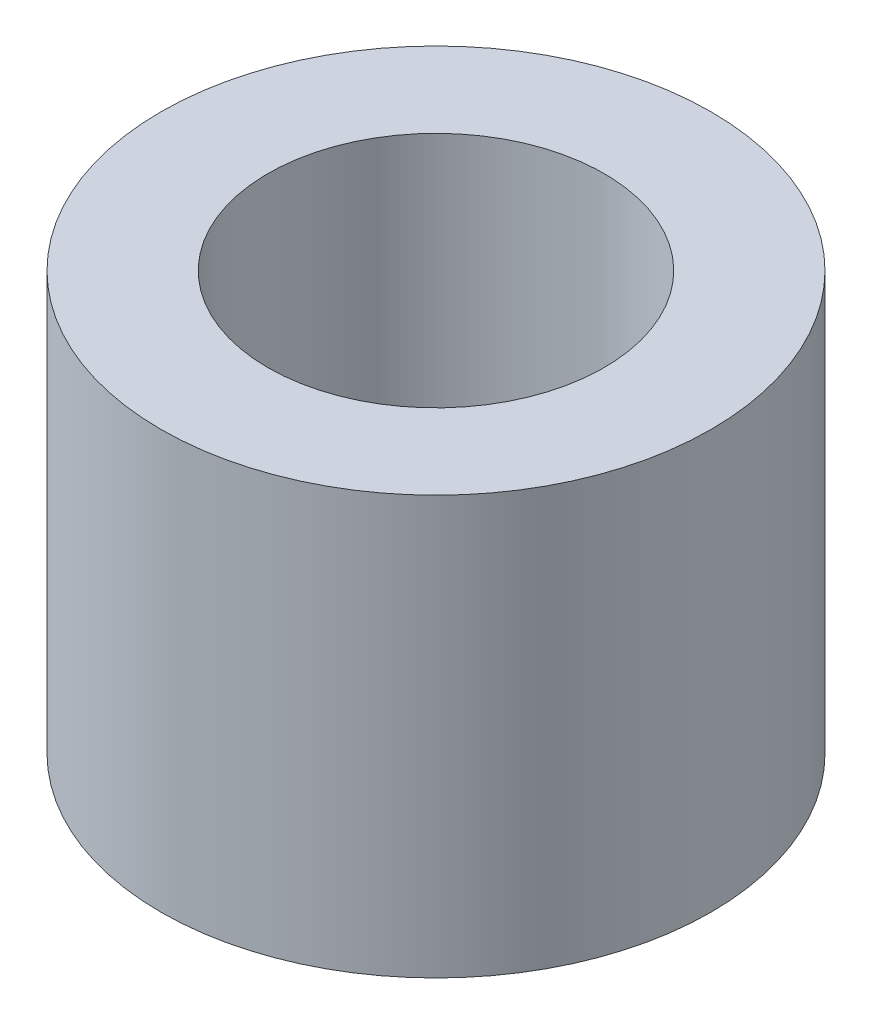
ISO-10303-21;
HEADER;
FILE_DESCRIPTION(('STEP AP214'),'2;1');
FILE_NAME('part.step','',(''),(''),'','','');
FILE_SCHEMA(('AUTOMOTIVE_DESIGN { 1 0 10303 214 1 1 1 1 }'));
ENDSEC;
DATA;
#1=APPLICATION_CONTEXT('core data for automotive mechanical design processes');
#2=APPLICATION_PROTOCOL_DEFINITION('international standard','automotive_design',2000,#1);
#3=PRODUCT_CONTEXT('',#1,'mechanical');
#4=PRODUCT('Part','Part','',(#3));
#5=PRODUCT_RELATED_PRODUCT_CATEGORY('part','',(#4));
#6=PRODUCT_DEFINITION_FORMATION('','',#4);
#7=PRODUCT_DEFINITION_CONTEXT('part definition',#1,'design');
#8=PRODUCT_DEFINITION('design','',#6,#7);
#9=PRODUCT_DEFINITION_SHAPE('','',#8);
#10=(LENGTH_UNIT() NAMED_UNIT(*) SI_UNIT(.MILLI.,.METRE.));
#11=(NAMED_UNIT(*) PLANE_ANGLE_UNIT() SI_UNIT($,.RADIAN.));
#12=(NAMED_UNIT(*) SI_UNIT($,.STERADIAN.) SOLID_ANGLE_UNIT());
#13=UNCERTAINTY_MEASURE_WITH_UNIT(LENGTH_MEASURE(1.E-05),#10,'distance_accuracy_value','');
#14=(GEOMETRIC_REPRESENTATION_CONTEXT(3) GLOBAL_UNCERTAINTY_ASSIGNED_CONTEXT((#13)) GLOBAL_UNIT_ASSIGNED_CONTEXT((#10,
#11,#12)) REPRESENTATION_CONTEXT('',''));
#15=CARTESIAN_POINT('',(0.,0.,0.));
#16=DIRECTION('',(0.,0.,1.));
#17=DIRECTION('',(1.,0.,0.));
#18=AXIS2_PLACEMENT_3D('',#15,#16,#17);
#19=CARTESIAN_POINT('',(0.,-9.525,0.));
#20=DIRECTION('',(0.,1.,0.));
#21=DIRECTION('',(0.,0.,1.));
#22=AXIS2_PLACEMENT_3D('',#19,#20,#21);
#23=CYLINDRICAL_SURFACE('',#22,7.9375);
#24=CARTESIAN_POINT('',(0.,-9.525,0.));
#25=DIRECTION('',(0.,1.,0.));
#26=DIRECTION('',(0.,0.,1.));
#27=AXIS2_PLACEMENT_3D('',#24,#25,#26);
#28=CIRCLE('',#27,7.9375);
#29=CARTESIAN_POINT('',(0.,-9.525,7.9375));
#30=VERTEX_POINT('',#29);
#31=EDGE_CURVE('E10',#30,#30,#28,.T.);
#32=CARTESIAN_POINT('',(0.,2.54,0.));
#33=DIRECTION('',(0.,1.,0.));
#34=DIRECTION('',(0.,0.,1.));
#35=AXIS2_PLACEMENT_3D('',#32,#33,#34);
#36=CIRCLE('',#35,7.9375);
#37=CARTESIAN_POINT('',(0.,2.54,7.9375));
#38=VERTEX_POINT('',#37);
#39=EDGE_CURVE('E40',#38,#38,#36,.T.);
#40=CARTESIAN_POINT('',(0.,-9.525,7.9375));
#41=CARTESIAN_POINT('',(0.,-9.39932291666667,7.9375));
#42=CARTESIAN_POINT('',(0.,-9.27364583333333,7.9375));
#43=CARTESIAN_POINT('',(0.,-9.02229166666667,7.9375));
#44=CARTESIAN_POINT('',(0.,-8.89661458333333,7.9375));
#45=CARTESIAN_POINT('',(0.,-8.64526041666667,7.9375));
#46=CARTESIAN_POINT('',(0.,-8.51958333333333,7.9375));
#47=CARTESIAN_POINT('',(0.,-8.26822916666667,7.9375));
#48=CARTESIAN_POINT('',(0.,-8.14255208333333,7.9375));
#49=CARTESIAN_POINT('',(0.,-7.89119791666667,7.9375));
#50=CARTESIAN_POINT('',(0.,-7.76552083333333,7.9375));
#51=CARTESIAN_POINT('',(0.,-7.51416666666667,7.9375));
#52=CARTESIAN_POINT('',(0.,-7.38848958333333,7.9375));
#53=CARTESIAN_POINT('',(0.,-7.13713541666667,7.9375));
#54=CARTESIAN_POINT('',(0.,-7.01145833333333,7.9375));
#55=CARTESIAN_POINT('',(0.,-6.76010416666667,7.9375));
#56=CARTESIAN_POINT('',(0.,-6.63442708333333,7.9375));
#57=CARTESIAN_POINT('',(0.,-6.38307291666667,7.9375));
#58=CARTESIAN_POINT('',(0.,-6.25739583333333,7.9375));
#59=CARTESIAN_POINT('',(0.,-6.00604166666667,7.9375));
#60=CARTESIAN_POINT('',(0.,-5.88036458333333,7.9375));
#61=CARTESIAN_POINT('',(0.,-5.62901041666667,7.9375));
#62=CARTESIAN_POINT('',(0.,-5.50333333333333,7.9375));
#63=CARTESIAN_POINT('',(0.,-5.25197916666667,7.9375));
#64=CARTESIAN_POINT('',(0.,-5.12630208333333,7.9375));
#65=CARTESIAN_POINT('',(0.,-4.87494791666667,7.9375));
#66=CARTESIAN_POINT('',(0.,-4.74927083333333,7.9375));
#67=CARTESIAN_POINT('',(0.,-4.49791666666667,7.9375));
#68=CARTESIAN_POINT('',(0.,-4.37223958333333,7.9375));
#69=CARTESIAN_POINT('',(0.,-4.12088541666667,7.9375));
#70=CARTESIAN_POINT('',(0.,-3.99520833333333,7.9375));
#71=CARTESIAN_POINT('',(0.,-3.74385416666667,7.9375));
#72=CARTESIAN_POINT('',(0.,-3.61817708333333,7.9375));
#73=CARTESIAN_POINT('',(0.,-3.36682291666667,7.9375));
#74=CARTESIAN_POINT('',(0.,-3.24114583333333,7.9375));
#75=CARTESIAN_POINT('',(0.,-2.98979166666667,7.9375));
#76=CARTESIAN_POINT('',(0.,-2.86411458333333,7.9375));
#77=CARTESIAN_POINT('',(0.,-2.61276041666667,7.9375));
#78=CARTESIAN_POINT('',(0.,-2.48708333333333,7.9375));
#79=CARTESIAN_POINT('',(0.,-2.23572916666667,7.9375));
#80=CARTESIAN_POINT('',(0.,-2.11005208333333,7.9375));
#81=CARTESIAN_POINT('',(0.,-1.85869791666667,7.9375));
#82=CARTESIAN_POINT('',(0.,-1.73302083333333,7.9375));
#83=CARTESIAN_POINT('',(0.,-1.48166666666667,7.9375));
#84=CARTESIAN_POINT('',(0.,-1.35598958333333,7.9375));
#85=CARTESIAN_POINT('',(0.,-1.10463541666667,7.9375));
#86=CARTESIAN_POINT('',(0.,-0.978958333333334,7.9375));
#87=CARTESIAN_POINT('',(0.,-0.727604166666667,7.9375));
#88=CARTESIAN_POINT('',(0.,-0.601927083333334,7.9375));
#89=CARTESIAN_POINT('',(0.,-0.350572916666668,7.9375));
#90=CARTESIAN_POINT('',(0.,-0.224895833333334,7.9375));
#91=CARTESIAN_POINT('',(0.,0.0264583333333326,7.9375));
#92=CARTESIAN_POINT('',(0.,0.152135416666666,7.9375));
#93=CARTESIAN_POINT('',(0.,0.403489583333334,7.9375));
#94=CARTESIAN_POINT('',(0.,0.529166666666667,7.9375));
#95=CARTESIAN_POINT('',(0.,0.780520833333333,7.9375));
#96=CARTESIAN_POINT('',(0.,0.906197916666667,7.9375));
#97=CARTESIAN_POINT('',(0.,1.15755208333333,7.9375));
#98=CARTESIAN_POINT('',(0.,1.28322916666667,7.9375));
#99=CARTESIAN_POINT('',(0.,1.53458333333333,7.9375));
#100=CARTESIAN_POINT('',(0.,1.66026041666667,7.9375));
#101=CARTESIAN_POINT('',(0.,1.91161458333333,7.9375));
#102=CARTESIAN_POINT('',(0.,2.03729166666667,7.9375));
#103=CARTESIAN_POINT('',(0.,2.28864583333333,7.9375));
#104=CARTESIAN_POINT('',(0.,2.41432291666667,7.9375));
#105=CARTESIAN_POINT('',(0.,2.54,7.9375));
#106=B_SPLINE_CURVE_WITH_KNOTS('',3,(#40,#41,#42,#43,#44,#45,#46,#47,#48,#49,#50,#51,#52,#53,
#54,#55,#56,#57,#58,#59,#60,#61,#62,#63,#64,#65,#66,#67,#68,#69,#70,#71,#72,#73,#74,#75,#76,#77,
#78,#79,#80,#81,#82,#83,#84,#85,#86,#87,#88,#89,#90,#91,#92,#93,#94,#95,#96,#97,#98,#99,#100,
#101,#102,#103,#104,#105),.UNSPECIFIED.,.F.,.F.,(4,2,2,2,2,2,2,2,2,2,2,2,2,2,2,2,2,2,2,2,2,2,2,
2,2,2,2,2,2,2,2,2,4),(0.,0.377031250000001,0.754062500000001,1.13109375,1.508125,1.88515625,
2.2621875,2.63921875,3.01625,3.39328125,3.7703125,4.14734375,4.524375,4.90140625,5.2784375,
5.65546875,6.0325,6.40953125,6.7865625,7.16359375,7.540625,7.91765625,8.2946875,8.67171875,
9.04875,9.42578125,9.8028125,10.17984375,10.556875,10.93390625,11.3109375,11.68796875,12.065),.UNSPECIFIED.);
#107=EDGE_CURVE('BSEAM30',#30,#38,#106,.T.);
#108=ORIENTED_EDGE('',*,*,#31,.T.);
#109=ORIENTED_EDGE('',*,*,#39,.F.);
#110=ORIENTED_EDGE('',*,*,#107,.T.);
#111=ORIENTED_EDGE('',*,*,#107,.F.);
#112=EDGE_LOOP('',(#108,#110,#109,#111));
#113=FACE_BOUND('',#112,.T.);
#114=ADVANCED_FACE('F30',(#113),#23,.T.);
#115=CARTESIAN_POINT('',(0.,-9.525,0.));
#116=DIRECTION('',(0.,1.,0.));
#117=DIRECTION('',(0.,0.,1.));
#118=AXIS2_PLACEMENT_3D('',#115,#116,#117);
#119=PLANE('',#118);
#120=CARTESIAN_POINT('',(0.,-9.525,0.));
#121=DIRECTION('',(0.,1.,0.));
#122=DIRECTION('',(0.,0.,1.));
#123=AXIS2_PLACEMENT_3D('',#120,#121,#122);
#124=CIRCLE('',#123,4.8514);
#125=CARTESIAN_POINT('',(0.,-9.525,4.8514));
#126=VERTEX_POINT('',#125);
#127=EDGE_CURVE('E36',#126,#126,#124,.T.);
#128=ORIENTED_EDGE('',*,*,#127,.T.);
#129=EDGE_LOOP('',(#128));
#130=FACE_BOUND('',#129,.T.);
#131=ORIENTED_EDGE('',*,*,#31,.F.);
#132=EDGE_LOOP('',(#131));
#133=FACE_BOUND('',#132,.T.);
#134=ADVANCED_FACE('F59',(#130,#133),#119,.F.);
#135=CARTESIAN_POINT('',(0.,-9.525,0.));
#136=DIRECTION('',(0.,1.,0.));
#137=DIRECTION('',(0.,0.,1.));
#138=AXIS2_PLACEMENT_3D('',#135,#136,#137);
#139=CYLINDRICAL_SURFACE('',#138,4.8514);
#140=CARTESIAN_POINT('',(0.,2.54,0.));
#141=DIRECTION('',(0.,1.,0.));
#142=DIRECTION('',(0.,0.,1.));
#143=AXIS2_PLACEMENT_3D('',#140,#141,#142);
#144=CIRCLE('',#143,4.8514);
#145=CARTESIAN_POINT('',(0.,2.54,4.8514));
#146=VERTEX_POINT('',#145);
#147=EDGE_CURVE('E44',#146,#146,#144,.T.);
#148=CARTESIAN_POINT('',(0.,-9.525,4.8514));
#149=CARTESIAN_POINT('',(0.,-9.39932291666667,4.8514));
#150=CARTESIAN_POINT('',(0.,-9.27364583333333,4.8514));
#151=CARTESIAN_POINT('',(0.,-9.02229166666667,4.8514));
#152=CARTESIAN_POINT('',(0.,-8.89661458333333,4.8514));
#153=CARTESIAN_POINT('',(0.,-8.64526041666667,4.8514));
#154=CARTESIAN_POINT('',(0.,-8.51958333333333,4.8514));
#155=CARTESIAN_POINT('',(0.,-8.26822916666667,4.8514));
#156=CARTESIAN_POINT('',(0.,-8.14255208333333,4.8514));
#157=CARTESIAN_POINT('',(0.,-7.89119791666667,4.8514));
#158=CARTESIAN_POINT('',(0.,-7.76552083333333,4.8514));
#159=CARTESIAN_POINT('',(0.,-7.51416666666667,4.8514));
#160=CARTESIAN_POINT('',(0.,-7.38848958333333,4.8514));
#161=CARTESIAN_POINT('',(0.,-7.13713541666667,4.8514));
#162=CARTESIAN_POINT('',(0.,-7.01145833333333,4.8514));
#163=CARTESIAN_POINT('',(0.,-6.76010416666667,4.8514));
#164=CARTESIAN_POINT('',(0.,-6.63442708333333,4.8514));
#165=CARTESIAN_POINT('',(0.,-6.38307291666667,4.8514));
#166=CARTESIAN_POINT('',(0.,-6.25739583333333,4.8514));
#167=CARTESIAN_POINT('',(0.,-6.00604166666667,4.8514));
#168=CARTESIAN_POINT('',(0.,-5.88036458333333,4.8514));
#169=CARTESIAN_POINT('',(0.,-5.62901041666667,4.8514));
#170=CARTESIAN_POINT('',(0.,-5.50333333333333,4.8514));
#171=CARTESIAN_POINT('',(0.,-5.25197916666667,4.8514));
#172=CARTESIAN_POINT('',(0.,-5.12630208333333,4.8514));
#173=CARTESIAN_POINT('',(0.,-4.87494791666667,4.8514));
#174=CARTESIAN_POINT('',(0.,-4.74927083333333,4.8514));
#175=CARTESIAN_POINT('',(0.,-4.49791666666667,4.8514));
#176=CARTESIAN_POINT('',(0.,-4.37223958333333,4.8514));
#177=CARTESIAN_POINT('',(0.,-4.12088541666667,4.8514));
#178=CARTESIAN_POINT('',(0.,-3.99520833333333,4.8514));
#179=CARTESIAN_POINT('',(0.,-3.74385416666667,4.8514));
#180=CARTESIAN_POINT('',(0.,-3.61817708333333,4.8514));
#181=CARTESIAN_POINT('',(0.,-3.36682291666667,4.8514));
#182=CARTESIAN_POINT('',(0.,-3.24114583333333,4.8514));
#183=CARTESIAN_POINT('',(0.,-2.98979166666667,4.8514));
#184=CARTESIAN_POINT('',(0.,-2.86411458333333,4.8514));
#185=CARTESIAN_POINT('',(0.,-2.61276041666667,4.8514));
#186=CARTESIAN_POINT('',(0.,-2.48708333333333,4.8514));
#187=CARTESIAN_POINT('',(0.,-2.23572916666667,4.8514));
#188=CARTESIAN_POINT('',(0.,-2.11005208333333,4.8514));
#189=CARTESIAN_POINT('',(0.,-1.85869791666667,4.8514));
#190=CARTESIAN_POINT('',(0.,-1.73302083333333,4.8514));
#191=CARTESIAN_POINT('',(0.,-1.48166666666667,4.8514));
#192=CARTESIAN_POINT('',(0.,-1.35598958333333,4.8514));
#193=CARTESIAN_POINT('',(0.,-1.10463541666667,4.8514));
#194=CARTESIAN_POINT('',(0.,-0.978958333333334,4.8514));
#195=CARTESIAN_POINT('',(0.,-0.727604166666667,4.8514));
#196=CARTESIAN_POINT('',(0.,-0.601927083333334,4.8514));
#197=CARTESIAN_POINT('',(0.,-0.350572916666668,4.8514));
#198=CARTESIAN_POINT('',(0.,-0.224895833333334,4.8514));
#199=CARTESIAN_POINT('',(0.,0.0264583333333326,4.8514));
#200=CARTESIAN_POINT('',(0.,0.152135416666666,4.8514));
#201=CARTESIAN_POINT('',(0.,0.403489583333334,4.8514));
#202=CARTESIAN_POINT('',(0.,0.529166666666667,4.8514));
#203=CARTESIAN_POINT('',(0.,0.780520833333333,4.8514));
#204=CARTESIAN_POINT('',(0.,0.906197916666667,4.8514));
#205=CARTESIAN_POINT('',(0.,1.15755208333333,4.8514));
#206=CARTESIAN_POINT('',(0.,1.28322916666667,4.8514));
#207=CARTESIAN_POINT('',(0.,1.53458333333333,4.8514));
#208=CARTESIAN_POINT('',(0.,1.66026041666667,4.8514));
#209=CARTESIAN_POINT('',(0.,1.91161458333333,4.8514));
#210=CARTESIAN_POINT('',(0.,2.03729166666667,4.8514));
#211=CARTESIAN_POINT('',(0.,2.28864583333333,4.8514));
#212=CARTESIAN_POINT('',(0.,2.41432291666667,4.8514));
#213=CARTESIAN_POINT('',(0.,2.54,4.8514));
#214=B_SPLINE_CURVE_WITH_KNOTS('',3,(#148,#149,#150,#151,#152,#153,#154,#155,#156,#157,#158,
#159,#160,#161,#162,#163,#164,#165,#166,#167,#168,#169,#170,#171,#172,#173,#174,#175,#176,#177,
#178,#179,#180,#181,#182,#183,#184,#185,#186,#187,#188,#189,#190,#191,#192,#193,#194,#195,#196,
#197,#198,#199,#200,#201,#202,#203,#204,#205,#206,#207,#208,#209,#210,#211,#212,#213),
.UNSPECIFIED.,.F.,.F.,(4,2,2,2,2,2,2,2,2,2,2,2,2,2,2,2,2,2,2,2,2,2,2,2,2,2,2,2,2,2,2,2,4),(0.,
0.377031250000001,0.754062500000001,1.13109375,1.508125,1.88515625,2.2621875,2.63921875,3.01625,
3.39328125,3.7703125,4.14734375,4.524375,4.90140625,5.2784375,5.65546875,6.0325,6.40953125,
6.7865625,7.16359375,7.540625,7.91765625,8.2946875,8.67171875,9.04875,9.42578125,9.8028125,
10.17984375,10.556875,10.93390625,11.3109375,11.68796875,12.065),.UNSPECIFIED.);
#215=EDGE_CURVE('BSEAM50',#126,#146,#214,.T.);
#216=ORIENTED_EDGE('',*,*,#127,.F.);
#217=ORIENTED_EDGE('',*,*,#147,.T.);
#218=ORIENTED_EDGE('',*,*,#215,.T.);
#219=ORIENTED_EDGE('',*,*,#215,.F.);
#220=EDGE_LOOP('',(#216,#218,#217,#219));
#221=FACE_BOUND('',#220,.T.);
#222=ADVANCED_FACE('F50',(#221),#139,.F.);
#223=CARTESIAN_POINT('',(0.,2.54,0.));
#224=DIRECTION('',(0.,1.,0.));
#225=DIRECTION('',(0.,0.,1.));
#226=AXIS2_PLACEMENT_3D('',#223,#224,#225);
#227=PLANE('',#226);
#228=ORIENTED_EDGE('',*,*,#39,.T.);
#229=EDGE_LOOP('',(#228));
#230=FACE_BOUND('',#229,.T.);
#231=ORIENTED_EDGE('',*,*,#147,.F.);
#232=EDGE_LOOP('',(#231));
#233=FACE_BOUND('',#232,.T.);
#234=ADVANCED_FACE('F52',(#230,#233),#227,.T.);
#235=CLOSED_SHELL('',(#114,#134,#222,#234));
#236=MANIFOLD_SOLID_BREP('B2',#235);
#237=ADVANCED_BREP_SHAPE_REPRESENTATION('',(#18,#236),#14);
#238=SHAPE_DEFINITION_REPRESENTATION(#9,#237);
ENDSEC;
END-ISO-10303-21;
